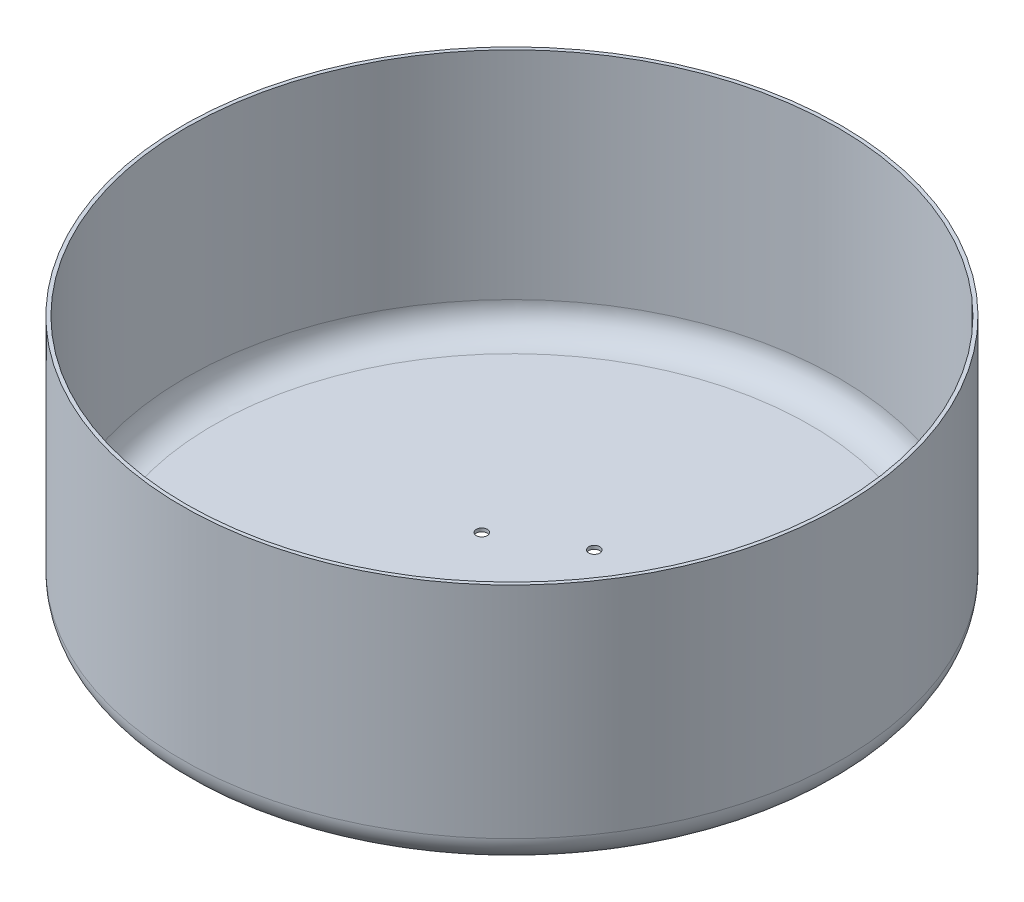
ISO-10303-21;
HEADER;
FILE_DESCRIPTION(('STEP AP214'),'2;1');
FILE_NAME('part.step','',(''),(''),'','','');
FILE_SCHEMA(('AUTOMOTIVE_DESIGN { 1 0 10303 214 1 1 1 1 }'));
ENDSEC;
DATA;
#1=APPLICATION_CONTEXT('core data for automotive mechanical design processes');
#2=APPLICATION_PROTOCOL_DEFINITION('international standard','automotive_design',2000,#1);
#3=PRODUCT_CONTEXT('',#1,'mechanical');
#4=PRODUCT('Part','Part','',(#3));
#5=PRODUCT_RELATED_PRODUCT_CATEGORY('part','',(#4));
#6=PRODUCT_DEFINITION_FORMATION('','',#4);
#7=PRODUCT_DEFINITION_CONTEXT('part definition',#1,'design');
#8=PRODUCT_DEFINITION('design','',#6,#7);
#9=PRODUCT_DEFINITION_SHAPE('','',#8);
#10=(LENGTH_UNIT() NAMED_UNIT(*) SI_UNIT(.MILLI.,.METRE.));
#11=(NAMED_UNIT(*) PLANE_ANGLE_UNIT() SI_UNIT($,.RADIAN.));
#12=(NAMED_UNIT(*) SI_UNIT($,.STERADIAN.) SOLID_ANGLE_UNIT());
#13=UNCERTAINTY_MEASURE_WITH_UNIT(LENGTH_MEASURE(1.E-05),#10,'distance_accuracy_value','');
#14=(GEOMETRIC_REPRESENTATION_CONTEXT(3) GLOBAL_UNCERTAINTY_ASSIGNED_CONTEXT((#13)) GLOBAL_UNIT_ASSIGNED_CONTEXT((#10,
#11,#12)) REPRESENTATION_CONTEXT('',''));
#15=CARTESIAN_POINT('',(0.,0.,0.));
#16=DIRECTION('',(0.,0.,1.));
#17=DIRECTION('',(1.,0.,0.));
#18=AXIS2_PLACEMENT_3D('',#15,#16,#17);
#19=CARTESIAN_POINT('',(0.,0.,0.));
#20=DIRECTION('',(0.,-1.,0.));
#21=DIRECTION('',(0.,0.,-1.));
#22=AXIS2_PLACEMENT_3D('',#19,#20,#21);
#23=PLANE('',#22);
#24=CARTESIAN_POINT('',(0.,0.,38.1));
#25=DIRECTION('',(0.,-1.,0.));
#26=DIRECTION('',(0.,0.,-1.));
#27=AXIS2_PLACEMENT_3D('',#24,#25,#26);
#28=CIRCLE('',#27,2.55269999999999);
#29=CARTESIAN_POINT('',(0.,0.,35.5473));
#30=VERTEX_POINT('',#29);
#31=EDGE_CURVE('E87',#30,#30,#28,.T.);
#32=ORIENTED_EDGE('',*,*,#31,.F.);
#33=EDGE_LOOP('',(#32));
#34=FACE_BOUND('',#33,.T.);
#35=CARTESIAN_POINT('',(32.9955678841872,0.,19.0499999999999));
#36=DIRECTION('',(0.,-1.,0.));
#37=DIRECTION('',(0.,0.,-1.));
#38=AXIS2_PLACEMENT_3D('',#35,#36,#37);
#39=CIRCLE('',#38,2.55269999999999);
#40=CARTESIAN_POINT('',(32.9955678841872,0.,16.4972999999999));
#41=VERTEX_POINT('',#40);
#42=EDGE_CURVE('E77',#41,#41,#39,.T.);
#43=ORIENTED_EDGE('',*,*,#42,.F.);
#44=EDGE_LOOP('',(#43));
#45=FACE_BOUND('',#44,.T.);
#46=CARTESIAN_POINT('',(32.995567884187,0.,-19.0500000000002));
#47=DIRECTION('',(0.,-1.,0.));
#48=DIRECTION('',(0.,0.,-1.));
#49=AXIS2_PLACEMENT_3D('',#46,#47,#48);
#50=CIRCLE('',#49,2.55269999999999);
#51=CARTESIAN_POINT('',(32.995567884187,0.,-21.6027000000001));
#52=VERTEX_POINT('',#51);
#53=EDGE_CURVE('E74',#52,#52,#50,.T.);
#54=ORIENTED_EDGE('',*,*,#53,.F.);
#55=EDGE_LOOP('',(#54));
#56=FACE_BOUND('',#55,.T.);
#57=CARTESIAN_POINT('',(-2.66051032116535E-13,0.,-38.1));
#58=DIRECTION('',(0.,-1.,0.));
#59=DIRECTION('',(0.,0.,-1.));
#60=AXIS2_PLACEMENT_3D('',#57,#58,#59);
#61=CIRCLE('',#60,2.55269999999999);
#62=CARTESIAN_POINT('',(-2.66051032116535E-13,0.,-40.6527));
#63=VERTEX_POINT('',#62);
#64=EDGE_CURVE('E71',#63,#63,#61,.T.);
#65=ORIENTED_EDGE('',*,*,#64,.F.);
#66=EDGE_LOOP('',(#65));
#67=FACE_BOUND('',#66,.T.);
#68=CARTESIAN_POINT('',(-32.9955678841873,0.,-19.0499999999997));
#69=DIRECTION('',(0.,-1.,0.));
#70=DIRECTION('',(0.,0.,-1.));
#71=AXIS2_PLACEMENT_3D('',#68,#69,#70);
#72=CIRCLE('',#71,2.55269999999999);
#73=CARTESIAN_POINT('',(-32.9955678841873,0.,-21.6026999999997));
#74=VERTEX_POINT('',#73);
#75=EDGE_CURVE('E67',#74,#74,#72,.T.);
#76=ORIENTED_EDGE('',*,*,#75,.F.);
#77=EDGE_LOOP('',(#76));
#78=FACE_BOUND('',#77,.T.);
#79=CARTESIAN_POINT('',(-32.9955678841869,0.,19.0500000000004));
#80=DIRECTION('',(0.,-1.,0.));
#81=DIRECTION('',(0.,0.,-1.));
#82=AXIS2_PLACEMENT_3D('',#79,#80,#81);
#83=CIRCLE('',#82,2.55269999999999);
#84=CARTESIAN_POINT('',(-32.9955678841869,0.,16.4973000000004));
#85=VERTEX_POINT('',#84);
#86=EDGE_CURVE('E63',#85,#85,#83,.T.);
#87=ORIENTED_EDGE('',*,*,#86,.F.);
#88=EDGE_LOOP('',(#87));
#89=FACE_BOUND('',#88,.T.);
#90=CARTESIAN_POINT('',(0.,0.,0.));
#91=DIRECTION('',(0.,-1.,0.));
#92=DIRECTION('',(0.,0.,-1.));
#93=AXIS2_PLACEMENT_3D('',#90,#91,#92);
#94=CIRCLE('',#93,139.7);
#95=CARTESIAN_POINT('',(0.,0.,-139.7));
#96=VERTEX_POINT('',#95);
#97=EDGE_CURVE('E101',#96,#96,#94,.T.);
#98=ORIENTED_EDGE('',*,*,#97,.T.);
#99=EDGE_LOOP('',(#98));
#100=FACE_BOUND('',#99,.T.);
#101=ADVANCED_FACE('F42',(#34,#45,#56,#67,#78,#89,#100),#23,.T.);
#102=CARTESIAN_POINT('',(0.,0.,0.));
#103=DIRECTION('',(0.,-1.,0.));
#104=DIRECTION('',(0.,0.,-1.));
#105=AXIS2_PLACEMENT_3D('',#102,#103,#104);
#106=CYLINDRICAL_SURFACE('',#105,152.4);
#107=CARTESIAN_POINT('',(0.,12.7,0.));
#108=DIRECTION('',(0.,-1.,0.));
#109=DIRECTION('',(0.,0.,-1.));
#110=AXIS2_PLACEMENT_3D('',#107,#108,#109);
#111=CIRCLE('',#110,152.4);
#112=CARTESIAN_POINT('',(0.,12.7,-152.4));
#113=VERTEX_POINT('',#112);
#114=EDGE_CURVE('E55',#113,#113,#111,.F.);
#115=ORIENTED_EDGE('',*,*,#114,.T.);
#116=EDGE_LOOP('',(#115));
#117=FACE_BOUND('',#116,.T.);
#118=CARTESIAN_POINT('',(0.,114.3,0.));
#119=DIRECTION('',(0.,-1.,0.));
#120=DIRECTION('',(0.,0.,-1.));
#121=AXIS2_PLACEMENT_3D('',#118,#119,#120);
#122=CIRCLE('',#121,152.4);
#123=CARTESIAN_POINT('',(0.,114.3,-152.4));
#124=VERTEX_POINT('',#123);
#125=EDGE_CURVE('E98',#124,#124,#122,.T.);
#126=ORIENTED_EDGE('',*,*,#125,.T.);
#127=EDGE_LOOP('',(#126));
#128=FACE_BOUND('',#127,.T.);
#129=ADVANCED_FACE('F106',(#117,#128),#106,.T.);
#130=CARTESIAN_POINT('',(152.4,114.3,0.));
#131=DIRECTION('',(0.,1.,0.));
#132=DIRECTION('',(0.,0.,1.));
#133=AXIS2_PLACEMENT_3D('',#130,#131,#132);
#134=PLANE('',#133);
#135=CARTESIAN_POINT('',(0.,114.3,0.));
#136=DIRECTION('',(0.,-1.,0.));
#137=DIRECTION('',(0.,0.,-1.));
#138=AXIS2_PLACEMENT_3D('',#135,#136,#137);
#139=CIRCLE('',#138,150.749);
#140=CARTESIAN_POINT('',(0.,114.3,-150.749));
#141=VERTEX_POINT('',#140);
#142=EDGE_CURVE('E62',#141,#141,#139,.T.);
#143=ORIENTED_EDGE('',*,*,#142,.T.);
#144=EDGE_LOOP('',(#143));
#145=FACE_BOUND('',#144,.T.);
#146=ORIENTED_EDGE('',*,*,#125,.F.);
#147=EDGE_LOOP('',(#146));
#148=FACE_BOUND('',#147,.T.);
#149=ADVANCED_FACE('F121',(#145,#148),#134,.T.);
#150=CARTESIAN_POINT('',(0.,0.,0.));
#151=DIRECTION('',(0.,-1.,0.));
#152=DIRECTION('',(0.,0.,-1.));
#153=AXIS2_PLACEMENT_3D('',#150,#151,#152);
#154=CYLINDRICAL_SURFACE('',#153,150.749);
#155=CARTESIAN_POINT('',(0.,14.2748,0.));
#156=DIRECTION('',(0.,1.,0.));
#157=DIRECTION('',(0.,0.,1.));
#158=AXIS2_PLACEMENT_3D('',#155,#156,#157);
#159=CIRCLE('',#158,150.749);
#160=CARTESIAN_POINT('',(0.,14.2748,150.749));
#161=VERTEX_POINT('',#160);
#162=EDGE_CURVE('E50',#161,#161,#159,.F.);
#163=ORIENTED_EDGE('',*,*,#162,.T.);
#164=EDGE_LOOP('',(#163));
#165=FACE_BOUND('',#164,.T.);
#166=ORIENTED_EDGE('',*,*,#142,.F.);
#167=EDGE_LOOP('',(#166));
#168=FACE_BOUND('',#167,.T.);
#169=ADVANCED_FACE('F128',(#165,#168),#154,.F.);
#170=CARTESIAN_POINT('',(150.749,1.57479999999999,0.));
#171=DIRECTION('',(0.,1.,0.));
#172=DIRECTION('',(0.,0.,1.));
#173=AXIS2_PLACEMENT_3D('',#170,#171,#172);
#174=PLANE('',#173);
#175=CARTESIAN_POINT('',(0.,1.57479999999999,38.1));
#176=DIRECTION('',(0.,1.,0.));
#177=DIRECTION('',(0.,0.,1.));
#178=AXIS2_PLACEMENT_3D('',#175,#176,#177);
#179=CIRCLE('',#178,2.55269999999999);
#180=CARTESIAN_POINT('',(0.,1.57479999999999,40.6527));
#181=VERTEX_POINT('',#180);
#182=EDGE_CURVE('E46',#181,#181,#179,.T.);
#183=ORIENTED_EDGE('',*,*,#182,.F.);
#184=EDGE_LOOP('',(#183));
#185=FACE_BOUND('',#184,.T.);
#186=CARTESIAN_POINT('',(32.9955678841872,1.57479999999999,19.0499999999999));
#187=DIRECTION('',(0.,1.,0.));
#188=DIRECTION('',(0.,0.,1.));
#189=AXIS2_PLACEMENT_3D('',#186,#187,#188);
#190=CIRCLE('',#189,2.55269999999999);
#191=CARTESIAN_POINT('',(32.9955678841872,1.57479999999999,21.6026999999999));
#192=VERTEX_POINT('',#191);
#193=EDGE_CURVE('E75',#192,#192,#190,.T.);
#194=ORIENTED_EDGE('',*,*,#193,.F.);
#195=EDGE_LOOP('',(#194));
#196=FACE_BOUND('',#195,.T.);
#197=CARTESIAN_POINT('',(32.995567884187,1.57479999999999,-19.0500000000002));
#198=DIRECTION('',(0.,1.,0.));
#199=DIRECTION('',(0.,0.,1.));
#200=AXIS2_PLACEMENT_3D('',#197,#198,#199);
#201=CIRCLE('',#200,2.55269999999999);
#202=CARTESIAN_POINT('',(32.995567884187,1.57479999999999,-16.4973000000002));
#203=VERTEX_POINT('',#202);
#204=EDGE_CURVE('E72',#203,#203,#201,.T.);
#205=ORIENTED_EDGE('',*,*,#204,.F.);
#206=EDGE_LOOP('',(#205));
#207=FACE_BOUND('',#206,.T.);
#208=CARTESIAN_POINT('',(-2.66051032116535E-13,1.57479999999999,-38.1));
#209=DIRECTION('',(0.,1.,0.));
#210=DIRECTION('',(0.,0.,1.));
#211=AXIS2_PLACEMENT_3D('',#208,#209,#210);
#212=CIRCLE('',#211,2.55269999999999);
#213=CARTESIAN_POINT('',(-2.66051032116535E-13,1.57479999999999,-35.5473));
#214=VERTEX_POINT('',#213);
#215=EDGE_CURVE('E68',#214,#214,#212,.T.);
#216=ORIENTED_EDGE('',*,*,#215,.F.);
#217=EDGE_LOOP('',(#216));
#218=FACE_BOUND('',#217,.T.);
#219=CARTESIAN_POINT('',(-32.9955678841873,1.57479999999999,-19.0499999999997));
#220=DIRECTION('',(0.,1.,0.));
#221=DIRECTION('',(0.,0.,1.));
#222=AXIS2_PLACEMENT_3D('',#219,#220,#221);
#223=CIRCLE('',#222,2.55269999999999);
#224=CARTESIAN_POINT('',(-32.9955678841873,1.57479999999999,-16.4972999999997));
#225=VERTEX_POINT('',#224);
#226=EDGE_CURVE('E64',#225,#225,#223,.T.);
#227=ORIENTED_EDGE('',*,*,#226,.F.);
#228=EDGE_LOOP('',(#227));
#229=FACE_BOUND('',#228,.T.);
#230=CARTESIAN_POINT('',(-32.9955678841869,1.57479999999999,19.0500000000004));
#231=DIRECTION('',(0.,1.,0.));
#232=DIRECTION('',(0.,0.,1.));
#233=AXIS2_PLACEMENT_3D('',#230,#231,#232);
#234=CIRCLE('',#233,2.55269999999999);
#235=CARTESIAN_POINT('',(-32.9955678841869,1.57479999999999,21.6027000000004));
#236=VERTEX_POINT('',#235);
#237=EDGE_CURVE('E59',#236,#236,#234,.T.);
#238=ORIENTED_EDGE('',*,*,#237,.F.);
#239=EDGE_LOOP('',(#238));
#240=FACE_BOUND('',#239,.T.);
#241=CARTESIAN_POINT('',(0.,1.57479999999999,0.));
#242=DIRECTION('',(0.,1.,0.));
#243=DIRECTION('',(0.,0.,1.));
#244=AXIS2_PLACEMENT_3D('',#241,#242,#243);
#245=CIRCLE('',#244,138.049);
#246=CARTESIAN_POINT('',(0.,1.57479999999999,138.049));
#247=VERTEX_POINT('',#246);
#248=EDGE_CURVE('E10',#247,#247,#245,.T.);
#249=ORIENTED_EDGE('',*,*,#248,.T.);
#250=EDGE_LOOP('',(#249));
#251=FACE_BOUND('',#250,.T.);
#252=ADVANCED_FACE('F112',(#185,#196,#207,#218,#229,#240,#251),#174,.T.);
#253=CARTESIAN_POINT('',(0.,12.7,0.));
#254=DIRECTION('',(0.,-1.,0.));
#255=DIRECTION('',(0.,0.,-1.));
#256=AXIS2_PLACEMENT_3D('',#253,#254,#255);
#257=TOROIDAL_SURFACE('',#256,139.7,12.7);
#258=ORIENTED_EDGE('',*,*,#114,.F.);
#259=EDGE_LOOP('',(#258));
#260=FACE_BOUND('',#259,.T.);
#261=ORIENTED_EDGE('',*,*,#97,.F.);
#262=EDGE_LOOP('',(#261));
#263=FACE_BOUND('',#262,.T.);
#264=ADVANCED_FACE('F109',(#260,#263),#257,.T.);
#265=CARTESIAN_POINT('',(0.,14.2748,0.));
#266=DIRECTION('',(0.,1.,0.));
#267=DIRECTION('',(0.,0.,1.));
#268=AXIS2_PLACEMENT_3D('',#265,#266,#267);
#269=TOROIDAL_SURFACE('',#268,138.049,12.7);
#270=ORIENTED_EDGE('',*,*,#248,.F.);
#271=EDGE_LOOP('',(#270));
#272=FACE_BOUND('',#271,.T.);
#273=ORIENTED_EDGE('',*,*,#162,.F.);
#274=EDGE_LOOP('',(#273));
#275=FACE_BOUND('',#274,.T.);
#276=ADVANCED_FACE('F44',(#272,#275),#269,.F.);
#277=CARTESIAN_POINT('',(-32.9955678841869,0.,19.0500000000004));
#278=DIRECTION('',(0.,-1.,0.));
#279=DIRECTION('',(0.,0.,-1.));
#280=AXIS2_PLACEMENT_3D('',#277,#278,#279);
#281=CYLINDRICAL_SURFACE('',#280,2.55269999999999);
#282=ORIENTED_EDGE('',*,*,#237,.T.);
#283=EDGE_LOOP('',(#282));
#284=FACE_BOUND('',#283,.T.);
#285=ORIENTED_EDGE('',*,*,#86,.T.);
#286=EDGE_LOOP('',(#285));
#287=FACE_BOUND('',#286,.T.);
#288=ADVANCED_FACE('F136',(#284,#287),#281,.F.);
#289=CARTESIAN_POINT('',(-32.9955678841873,0.,-19.0499999999997));
#290=DIRECTION('',(0.,-1.,0.));
#291=DIRECTION('',(0.,0.,-1.));
#292=AXIS2_PLACEMENT_3D('',#289,#290,#291);
#293=CYLINDRICAL_SURFACE('',#292,2.55269999999999);
#294=ORIENTED_EDGE('',*,*,#226,.T.);
#295=EDGE_LOOP('',(#294));
#296=FACE_BOUND('',#295,.T.);
#297=ORIENTED_EDGE('',*,*,#75,.T.);
#298=EDGE_LOOP('',(#297));
#299=FACE_BOUND('',#298,.T.);
#300=ADVANCED_FACE('F139',(#296,#299),#293,.F.);
#301=CARTESIAN_POINT('',(-2.66051032116535E-13,0.,-38.1));
#302=DIRECTION('',(0.,-1.,0.));
#303=DIRECTION('',(0.,0.,-1.));
#304=AXIS2_PLACEMENT_3D('',#301,#302,#303);
#305=CYLINDRICAL_SURFACE('',#304,2.55269999999999);
#306=ORIENTED_EDGE('',*,*,#215,.T.);
#307=EDGE_LOOP('',(#306));
#308=FACE_BOUND('',#307,.T.);
#309=ORIENTED_EDGE('',*,*,#64,.T.);
#310=EDGE_LOOP('',(#309));
#311=FACE_BOUND('',#310,.T.);
#312=ADVANCED_FACE('F143',(#308,#311),#305,.F.);
#313=CARTESIAN_POINT('',(32.995567884187,0.,-19.0500000000002));
#314=DIRECTION('',(0.,-1.,0.));
#315=DIRECTION('',(0.,0.,-1.));
#316=AXIS2_PLACEMENT_3D('',#313,#314,#315);
#317=CYLINDRICAL_SURFACE('',#316,2.55269999999999);
#318=ORIENTED_EDGE('',*,*,#204,.T.);
#319=EDGE_LOOP('',(#318));
#320=FACE_BOUND('',#319,.T.);
#321=ORIENTED_EDGE('',*,*,#53,.T.);
#322=EDGE_LOOP('',(#321));
#323=FACE_BOUND('',#322,.T.);
#324=ADVANCED_FACE('F147',(#320,#323),#317,.F.);
#325=CARTESIAN_POINT('',(32.9955678841872,0.,19.0499999999999));
#326=DIRECTION('',(0.,-1.,0.));
#327=DIRECTION('',(0.,0.,-1.));
#328=AXIS2_PLACEMENT_3D('',#325,#326,#327);
#329=CYLINDRICAL_SURFACE('',#328,2.55269999999999);
#330=ORIENTED_EDGE('',*,*,#193,.T.);
#331=EDGE_LOOP('',(#330));
#332=FACE_BOUND('',#331,.T.);
#333=ORIENTED_EDGE('',*,*,#42,.T.);
#334=EDGE_LOOP('',(#333));
#335=FACE_BOUND('',#334,.T.);
#336=ADVANCED_FACE('F151',(#332,#335),#329,.F.);
#337=CARTESIAN_POINT('',(0.,0.,38.1));
#338=DIRECTION('',(0.,-1.,0.));
#339=DIRECTION('',(0.,0.,-1.));
#340=AXIS2_PLACEMENT_3D('',#337,#338,#339);
#341=CYLINDRICAL_SURFACE('',#340,2.55269999999999);
#342=ORIENTED_EDGE('',*,*,#182,.T.);
#343=EDGE_LOOP('',(#342));
#344=FACE_BOUND('',#343,.T.);
#345=ORIENTED_EDGE('',*,*,#31,.T.);
#346=EDGE_LOOP('',(#345));
#347=FACE_BOUND('',#346,.T.);
#348=ADVANCED_FACE('F155',(#344,#347),#341,.F.);
#349=CLOSED_SHELL('',(#101,#129,#149,#169,#252,#264,#276,#288,#300,#312,#324,#336,#348));
#350=MANIFOLD_SOLID_BREP('B2',#349);
#351=ADVANCED_BREP_SHAPE_REPRESENTATION('',(#18,#350),#14);
#352=SHAPE_DEFINITION_REPRESENTATION(#9,#351);
ENDSEC;
END-ISO-10303-21;
